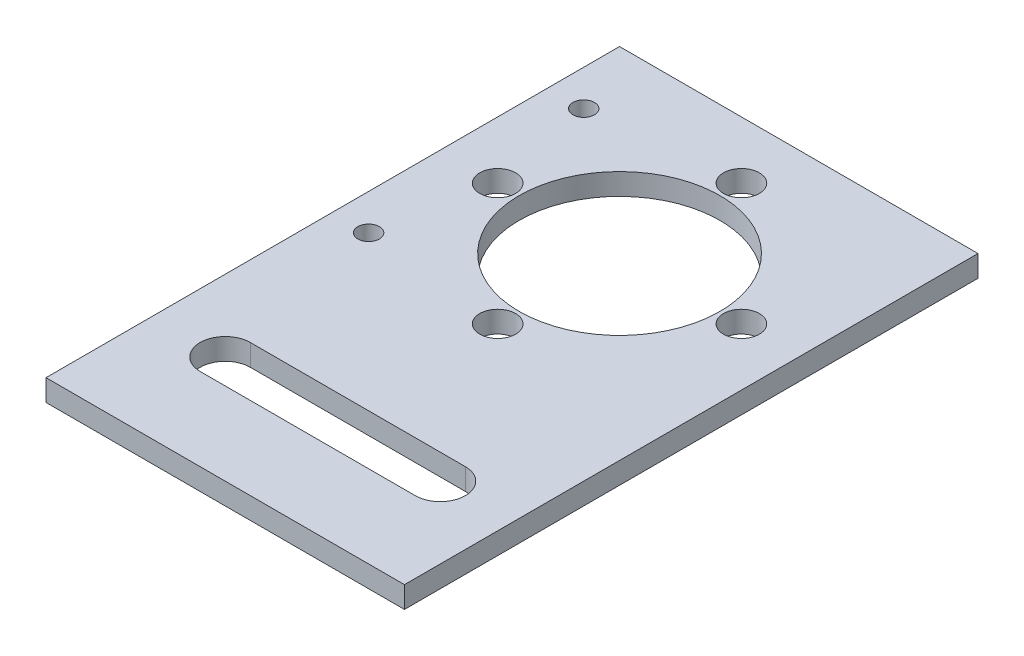
ISO-10303-21;
HEADER;
FILE_DESCRIPTION(('STEP AP214'),'2;1');
FILE_NAME('part.step','',(''),(''),'','','');
FILE_SCHEMA(('AUTOMOTIVE_DESIGN { 1 0 10303 214 1 1 1 1 }'));
ENDSEC;
DATA;
#1=APPLICATION_CONTEXT('core data for automotive mechanical design processes');
#2=APPLICATION_PROTOCOL_DEFINITION('international standard','automotive_design',2000,#1);
#3=PRODUCT_CONTEXT('',#1,'mechanical');
#4=PRODUCT('Part','Part','',(#3));
#5=PRODUCT_RELATED_PRODUCT_CATEGORY('part','',(#4));
#6=PRODUCT_DEFINITION_FORMATION('','',#4);
#7=PRODUCT_DEFINITION_CONTEXT('part definition',#1,'design');
#8=PRODUCT_DEFINITION('design','',#6,#7);
#9=PRODUCT_DEFINITION_SHAPE('','',#8);
#10=(LENGTH_UNIT() NAMED_UNIT(*) SI_UNIT(.MILLI.,.METRE.));
#11=(NAMED_UNIT(*) PLANE_ANGLE_UNIT() SI_UNIT($,.RADIAN.));
#12=(NAMED_UNIT(*) SI_UNIT($,.STERADIAN.) SOLID_ANGLE_UNIT());
#13=UNCERTAINTY_MEASURE_WITH_UNIT(LENGTH_MEASURE(1.E-05),#10,'distance_accuracy_value','');
#14=(GEOMETRIC_REPRESENTATION_CONTEXT(3) GLOBAL_UNCERTAINTY_ASSIGNED_CONTEXT((#13)) GLOBAL_UNIT_ASSIGNED_CONTEXT((#10,
#11,#12)) REPRESENTATION_CONTEXT('',''));
#15=CARTESIAN_POINT('',(0.,0.,0.));
#16=DIRECTION('',(0.,0.,1.));
#17=DIRECTION('',(1.,0.,0.));
#18=AXIS2_PLACEMENT_3D('',#15,#16,#17);
#19=CARTESIAN_POINT('',(0.,3.,0.));
#20=DIRECTION('',(0.,1.,0.));
#21=DIRECTION('',(0.,0.,1.));
#22=AXIS2_PLACEMENT_3D('',#19,#20,#21);
#23=PLANE('',#22);
#24=CARTESIAN_POINT('',(-20.,3.,0.));
#25=DIRECTION('',(0.,1.,0.));
#26=DIRECTION('',(0.,0.,1.));
#27=AXIS2_PLACEMENT_3D('',#24,#25,#26);
#28=CIRCLE('',#27,1.5);
#29=CARTESIAN_POINT('',(-20.,3.,1.5));
#30=VERTEX_POINT('',#29);
#31=EDGE_CURVE('E174',#30,#30,#28,.T.);
#32=ORIENTED_EDGE('',*,*,#31,.F.);
#33=EDGE_LOOP('',(#32));
#34=FACE_BOUND('',#33,.T.);
#35=CARTESIAN_POINT('',(-20.,3.,-30.));
#36=DIRECTION('',(0.,1.,0.));
#37=DIRECTION('',(0.,0.,1.));
#38=AXIS2_PLACEMENT_3D('',#35,#36,#37);
#39=CIRCLE('',#38,1.5);
#40=CARTESIAN_POINT('',(-20.,3.,-28.5));
#41=VERTEX_POINT('',#40);
#42=EDGE_CURVE('E180',#41,#41,#39,.T.);
#43=ORIENTED_EDGE('',*,*,#42,.F.);
#44=EDGE_LOOP('',(#43));
#45=FACE_BOUND('',#44,.T.);
#46=CARTESIAN_POINT('',(-17.,3.,-15.));
#47=DIRECTION('',(0.,1.,0.));
#48=DIRECTION('',(0.,0.,1.));
#49=AXIS2_PLACEMENT_3D('',#46,#47,#48);
#50=CIRCLE('',#49,2.49999999999988);
#51=CARTESIAN_POINT('',(-17.,3.,-12.5000000000001));
#52=VERTEX_POINT('',#51);
#53=EDGE_CURVE('E193',#52,#52,#50,.T.);
#54=ORIENTED_EDGE('',*,*,#53,.F.);
#55=EDGE_LOOP('',(#54));
#56=FACE_BOUND('',#55,.T.);
#57=CARTESIAN_POINT('',(17.,3.,-15.));
#58=DIRECTION('',(0.,1.,0.));
#59=DIRECTION('',(0.,0.,1.));
#60=AXIS2_PLACEMENT_3D('',#57,#58,#59);
#61=CIRCLE('',#60,2.4999999999999);
#62=CARTESIAN_POINT('',(17.,3.,-12.5000000000001));
#63=VERTEX_POINT('',#62);
#64=EDGE_CURVE('E132',#63,#63,#61,.T.);
#65=ORIENTED_EDGE('',*,*,#64,.F.);
#66=EDGE_LOOP('',(#65));
#67=FACE_BOUND('',#66,.T.);
#68=DIRECTION('',(0.,0.,-1.));
#69=VECTOR('',#68,1.);
#70=CARTESIAN_POINT('',(25.,3.,-40.));
#71=LINE('',#70,#69);
#72=CARTESIAN_POINT('',(25.,3.,40.));
#73=VERTEX_POINT('',#72);
#74=CARTESIAN_POINT('',(25.,3.,-40.));
#75=VERTEX_POINT('',#74);
#76=EDGE_CURVE('E148',#73,#75,#71,.T.);
#77=ORIENTED_EDGE('',*,*,#76,.T.);
#78=DIRECTION('',(-1.,0.,0.));
#79=VECTOR('',#78,1.);
#80=CARTESIAN_POINT('',(-25.,3.,-40.));
#81=LINE('',#80,#79);
#82=CARTESIAN_POINT('',(-25.,3.,-40.));
#83=VERTEX_POINT('',#82);
#84=EDGE_CURVE('E151',#75,#83,#81,.T.);
#85=ORIENTED_EDGE('',*,*,#84,.T.);
#86=DIRECTION('',(0.,0.,1.));
#87=VECTOR('',#86,1.);
#88=CARTESIAN_POINT('',(-25.,3.,-40.));
#89=LINE('',#88,#87);
#90=CARTESIAN_POINT('',(-25.,3.,40.));
#91=VERTEX_POINT('',#90);
#92=EDGE_CURVE('E154',#83,#91,#89,.T.);
#93=ORIENTED_EDGE('',*,*,#92,.T.);
#94=DIRECTION('',(1.,0.,0.));
#95=VECTOR('',#94,1.);
#96=CARTESIAN_POINT('',(-25.,3.,40.));
#97=LINE('',#96,#95);
#98=EDGE_CURVE('E156',#91,#73,#97,.T.);
#99=ORIENTED_EDGE('',*,*,#98,.T.);
#100=EDGE_LOOP('',(#77,#85,#93,#99));
#101=FACE_BOUND('',#100,.T.);
#102=CARTESIAN_POINT('',(0.,3.,-32.));
#103=DIRECTION('',(0.,1.,0.));
#104=DIRECTION('',(0.,0.,1.));
#105=AXIS2_PLACEMENT_3D('',#102,#103,#104);
#106=CIRCLE('',#105,2.5);
#107=CARTESIAN_POINT('',(0.,3.,-29.5));
#108=VERTEX_POINT('',#107);
#109=EDGE_CURVE('E142',#108,#108,#106,.T.);
#110=ORIENTED_EDGE('',*,*,#109,.F.);
#111=EDGE_LOOP('',(#110));
#112=FACE_BOUND('',#111,.T.);
#113=DIRECTION('',(1.,0.,0.));
#114=VECTOR('',#113,1.);
#115=CARTESIAN_POINT('',(-15.,3.,28.5));
#116=LINE('',#115,#114);
#117=CARTESIAN_POINT('',(-15.,3.,28.5));
#118=VERTEX_POINT('',#117);
#119=CARTESIAN_POINT('',(15.,3.,28.5));
#120=VERTEX_POINT('',#119);
#121=EDGE_CURVE('E111',#118,#120,#116,.T.);
#122=ORIENTED_EDGE('',*,*,#121,.F.);
#123=CARTESIAN_POINT('',(-15.,3.,25.));
#124=DIRECTION('',(0.,1.,0.));
#125=DIRECTION('',(0.,0.,1.));
#126=AXIS2_PLACEMENT_3D('',#123,#124,#125);
#127=CIRCLE('',#126,3.5);
#128=CARTESIAN_POINT('',(-15.,3.,21.5));
#129=VERTEX_POINT('',#128);
#130=EDGE_CURVE('E103',#129,#118,#127,.T.);
#131=ORIENTED_EDGE('',*,*,#130,.F.);
#132=DIRECTION('',(-1.,0.,0.));
#133=VECTOR('',#132,1.);
#134=CARTESIAN_POINT('',(-15.,3.,21.5));
#135=LINE('',#134,#133);
#136=CARTESIAN_POINT('',(15.,3.,21.5));
#137=VERTEX_POINT('',#136);
#138=EDGE_CURVE('E126',#137,#129,#135,.T.);
#139=ORIENTED_EDGE('',*,*,#138,.F.);
#140=CARTESIAN_POINT('',(15.,3.,25.));
#141=DIRECTION('',(0.,1.,0.));
#142=DIRECTION('',(0.,0.,1.));
#143=AXIS2_PLACEMENT_3D('',#140,#141,#142);
#144=CIRCLE('',#143,3.5);
#145=EDGE_CURVE('E124',#120,#137,#144,.T.);
#146=ORIENTED_EDGE('',*,*,#145,.F.);
#147=EDGE_LOOP('',(#122,#131,#139,#146));
#148=FACE_BOUND('',#147,.T.);
#149=CARTESIAN_POINT('',(0.,3.,2.));
#150=DIRECTION('',(0.,1.,0.));
#151=DIRECTION('',(0.,0.,1.));
#152=AXIS2_PLACEMENT_3D('',#149,#150,#151);
#153=CIRCLE('',#152,2.5);
#154=CARTESIAN_POINT('',(0.,3.,4.5));
#155=VERTEX_POINT('',#154);
#156=EDGE_CURVE('E199',#155,#155,#153,.T.);
#157=ORIENTED_EDGE('',*,*,#156,.F.);
#158=EDGE_LOOP('',(#157));
#159=FACE_BOUND('',#158,.T.);
#160=CARTESIAN_POINT('',(0.,3.,-15.));
#161=DIRECTION('',(0.,1.,0.));
#162=DIRECTION('',(0.,0.,1.));
#163=AXIS2_PLACEMENT_3D('',#160,#161,#162);
#164=CIRCLE('',#163,14.);
#165=CARTESIAN_POINT('',(0.,3.,-0.999999999999999));
#166=VERTEX_POINT('',#165);
#167=EDGE_CURVE('E187',#166,#166,#164,.T.);
#168=ORIENTED_EDGE('',*,*,#167,.F.);
#169=EDGE_LOOP('',(#168));
#170=FACE_BOUND('',#169,.T.);
#171=ADVANCED_FACE('F36',(#34,#45,#56,#67,#101,#112,#148,#159,#170),#23,.T.);
#172=CARTESIAN_POINT('',(0.,0.,0.));
#173=DIRECTION('',(0.,1.,0.));
#174=DIRECTION('',(0.,0.,1.));
#175=AXIS2_PLACEMENT_3D('',#172,#173,#174);
#176=PLANE('',#175);
#177=CARTESIAN_POINT('',(-20.,0.,0.));
#178=DIRECTION('',(0.,1.,0.));
#179=DIRECTION('',(0.,0.,1.));
#180=AXIS2_PLACEMENT_3D('',#177,#178,#179);
#181=CIRCLE('',#180,1.5);
#182=CARTESIAN_POINT('',(-20.,0.,1.5));
#183=VERTEX_POINT('',#182);
#184=EDGE_CURVE('E40',#183,#183,#181,.T.);
#185=ORIENTED_EDGE('',*,*,#184,.T.);
#186=EDGE_LOOP('',(#185));
#187=FACE_BOUND('',#186,.T.);
#188=CARTESIAN_POINT('',(-20.,0.,-30.));
#189=DIRECTION('',(0.,1.,0.));
#190=DIRECTION('',(0.,0.,1.));
#191=AXIS2_PLACEMENT_3D('',#188,#189,#190);
#192=CIRCLE('',#191,1.5);
#193=CARTESIAN_POINT('',(-20.,0.,-28.5));
#194=VERTEX_POINT('',#193);
#195=EDGE_CURVE('E172',#194,#194,#192,.T.);
#196=ORIENTED_EDGE('',*,*,#195,.T.);
#197=EDGE_LOOP('',(#196));
#198=FACE_BOUND('',#197,.T.);
#199=CARTESIAN_POINT('',(0.,0.,-32.));
#200=DIRECTION('',(0.,1.,0.));
#201=DIRECTION('',(0.,0.,1.));
#202=AXIS2_PLACEMENT_3D('',#199,#200,#201);
#203=CIRCLE('',#202,2.5);
#204=CARTESIAN_POINT('',(0.,0.,-29.5));
#205=VERTEX_POINT('',#204);
#206=EDGE_CURVE('E119',#205,#205,#203,.T.);
#207=ORIENTED_EDGE('',*,*,#206,.T.);
#208=EDGE_LOOP('',(#207));
#209=FACE_BOUND('',#208,.T.);
#210=DIRECTION('',(0.,0.,-1.));
#211=VECTOR('',#210,1.);
#212=CARTESIAN_POINT('',(25.,0.,-40.));
#213=LINE('',#212,#211);
#214=CARTESIAN_POINT('',(25.,0.,40.));
#215=VERTEX_POINT('',#214);
#216=CARTESIAN_POINT('',(25.,0.,-40.));
#217=VERTEX_POINT('',#216);
#218=EDGE_CURVE('E145',#215,#217,#213,.T.);
#219=ORIENTED_EDGE('',*,*,#218,.F.);
#220=DIRECTION('',(1.,0.,0.));
#221=VECTOR('',#220,1.);
#222=CARTESIAN_POINT('',(-25.,0.,40.));
#223=LINE('',#222,#221);
#224=CARTESIAN_POINT('',(-25.,0.,40.));
#225=VERTEX_POINT('',#224);
#226=EDGE_CURVE('E152',#225,#215,#223,.T.);
#227=ORIENTED_EDGE('',*,*,#226,.F.);
#228=DIRECTION('',(0.,0.,1.));
#229=VECTOR('',#228,1.);
#230=CARTESIAN_POINT('',(-25.,0.,-40.));
#231=LINE('',#230,#229);
#232=CARTESIAN_POINT('',(-25.,0.,-40.));
#233=VERTEX_POINT('',#232);
#234=EDGE_CURVE('E163',#233,#225,#231,.T.);
#235=ORIENTED_EDGE('',*,*,#234,.F.);
#236=DIRECTION('',(-1.,0.,0.));
#237=VECTOR('',#236,1.);
#238=CARTESIAN_POINT('',(-25.,0.,-40.));
#239=LINE('',#238,#237);
#240=EDGE_CURVE('E161',#217,#233,#239,.T.);
#241=ORIENTED_EDGE('',*,*,#240,.F.);
#242=EDGE_LOOP('',(#219,#227,#235,#241));
#243=FACE_BOUND('',#242,.T.);
#244=CARTESIAN_POINT('',(-15.,0.,25.));
#245=DIRECTION('',(0.,1.,0.));
#246=DIRECTION('',(0.,0.,1.));
#247=AXIS2_PLACEMENT_3D('',#244,#245,#246);
#248=CIRCLE('',#247,3.5);
#249=CARTESIAN_POINT('',(-15.,0.,21.5));
#250=VERTEX_POINT('',#249);
#251=CARTESIAN_POINT('',(-15.,0.,28.5));
#252=VERTEX_POINT('',#251);
#253=EDGE_CURVE('E61',#250,#252,#248,.T.);
#254=ORIENTED_EDGE('',*,*,#253,.T.);
#255=DIRECTION('',(1.,0.,0.));
#256=VECTOR('',#255,1.);
#257=CARTESIAN_POINT('',(-15.,0.,28.5));
#258=LINE('',#257,#256);
#259=CARTESIAN_POINT('',(15.,0.,28.5));
#260=VERTEX_POINT('',#259);
#261=EDGE_CURVE('E118',#252,#260,#258,.T.);
#262=ORIENTED_EDGE('',*,*,#261,.T.);
#263=CARTESIAN_POINT('',(15.,0.,25.));
#264=DIRECTION('',(0.,1.,0.));
#265=DIRECTION('',(0.,0.,1.));
#266=AXIS2_PLACEMENT_3D('',#263,#264,#265);
#267=CIRCLE('',#266,3.5);
#268=CARTESIAN_POINT('',(15.,0.,21.5));
#269=VERTEX_POINT('',#268);
#270=EDGE_CURVE('E134',#260,#269,#267,.T.);
#271=ORIENTED_EDGE('',*,*,#270,.T.);
#272=DIRECTION('',(-1.,0.,0.));
#273=VECTOR('',#272,1.);
#274=CARTESIAN_POINT('',(-15.,0.,21.5));
#275=LINE('',#274,#273);
#276=EDGE_CURVE('E112',#269,#250,#275,.T.);
#277=ORIENTED_EDGE('',*,*,#276,.T.);
#278=EDGE_LOOP('',(#254,#262,#271,#277));
#279=FACE_BOUND('',#278,.T.);
#280=CARTESIAN_POINT('',(17.,0.,-15.));
#281=DIRECTION('',(0.,1.,0.));
#282=DIRECTION('',(0.,0.,1.));
#283=AXIS2_PLACEMENT_3D('',#280,#281,#282);
#284=CIRCLE('',#283,2.4999999999999);
#285=CARTESIAN_POINT('',(17.,0.,-12.5000000000001));
#286=VERTEX_POINT('',#285);
#287=EDGE_CURVE('E202',#286,#286,#284,.T.);
#288=ORIENTED_EDGE('',*,*,#287,.T.);
#289=EDGE_LOOP('',(#288));
#290=FACE_BOUND('',#289,.T.);
#291=CARTESIAN_POINT('',(0.,0.,2.));
#292=DIRECTION('',(0.,1.,0.));
#293=DIRECTION('',(0.,0.,1.));
#294=AXIS2_PLACEMENT_3D('',#291,#292,#293);
#295=CIRCLE('',#294,2.5);
#296=CARTESIAN_POINT('',(0.,0.,4.5));
#297=VERTEX_POINT('',#296);
#298=EDGE_CURVE('E196',#297,#297,#295,.T.);
#299=ORIENTED_EDGE('',*,*,#298,.T.);
#300=EDGE_LOOP('',(#299));
#301=FACE_BOUND('',#300,.T.);
#302=CARTESIAN_POINT('',(-17.,0.,-15.));
#303=DIRECTION('',(0.,1.,0.));
#304=DIRECTION('',(0.,0.,1.));
#305=AXIS2_PLACEMENT_3D('',#302,#303,#304);
#306=CIRCLE('',#305,2.49999999999988);
#307=CARTESIAN_POINT('',(-17.,0.,-12.5000000000001));
#308=VERTEX_POINT('',#307);
#309=EDGE_CURVE('E190',#308,#308,#306,.T.);
#310=ORIENTED_EDGE('',*,*,#309,.T.);
#311=EDGE_LOOP('',(#310));
#312=FACE_BOUND('',#311,.T.);
#313=CARTESIAN_POINT('',(0.,0.,-15.));
#314=DIRECTION('',(0.,1.,0.));
#315=DIRECTION('',(0.,0.,1.));
#316=AXIS2_PLACEMENT_3D('',#313,#314,#315);
#317=CIRCLE('',#316,14.);
#318=CARTESIAN_POINT('',(0.,0.,-0.999999999999999));
#319=VERTEX_POINT('',#318);
#320=EDGE_CURVE('E178',#319,#319,#317,.T.);
#321=ORIENTED_EDGE('',*,*,#320,.T.);
#322=EDGE_LOOP('',(#321));
#323=FACE_BOUND('',#322,.T.);
#324=ADVANCED_FACE('F209',(#187,#198,#209,#243,#279,#290,#301,#312,#323),#176,.F.);
#325=CARTESIAN_POINT('',(25.,3.,-40.));
#326=DIRECTION('',(-1.,0.,0.));
#327=DIRECTION('',(0.,0.,1.));
#328=AXIS2_PLACEMENT_3D('',#325,#326,#327);
#329=PLANE('',#328);
#330=ORIENTED_EDGE('',*,*,#218,.T.);
#331=DIRECTION('',(0.,-1.,0.));
#332=VECTOR('',#331,1.);
#333=CARTESIAN_POINT('',(25.,3.,-40.));
#334=LINE('',#333,#332);
#335=EDGE_CURVE('E11',#75,#217,#334,.T.);
#336=ORIENTED_EDGE('',*,*,#335,.F.);
#337=ORIENTED_EDGE('',*,*,#76,.F.);
#338=DIRECTION('',(0.,-1.,0.));
#339=VECTOR('',#338,1.);
#340=CARTESIAN_POINT('',(25.,3.,40.));
#341=LINE('',#340,#339);
#342=EDGE_CURVE('E158',#73,#215,#341,.T.);
#343=ORIENTED_EDGE('',*,*,#342,.T.);
#344=EDGE_LOOP('',(#330,#336,#337,#343));
#345=FACE_BOUND('',#344,.T.);
#346=ADVANCED_FACE('F38',(#345),#329,.F.);
#347=CARTESIAN_POINT('',(-25.,3.,-40.));
#348=DIRECTION('',(0.,0.,1.));
#349=DIRECTION('',(1.,0.,0.));
#350=AXIS2_PLACEMENT_3D('',#347,#348,#349);
#351=PLANE('',#350);
#352=ORIENTED_EDGE('',*,*,#240,.T.);
#353=DIRECTION('',(0.,-1.,0.));
#354=VECTOR('',#353,1.);
#355=CARTESIAN_POINT('',(-25.,3.,-40.));
#356=LINE('',#355,#354);
#357=EDGE_CURVE('E45',#83,#233,#356,.T.);
#358=ORIENTED_EDGE('',*,*,#357,.F.);
#359=ORIENTED_EDGE('',*,*,#84,.F.);
#360=ORIENTED_EDGE('',*,*,#335,.T.);
#361=EDGE_LOOP('',(#352,#358,#359,#360));
#362=FACE_BOUND('',#361,.T.);
#363=ADVANCED_FACE('F246',(#362),#351,.F.);
#364=CARTESIAN_POINT('',(-25.,3.,-40.));
#365=DIRECTION('',(1.,0.,0.));
#366=DIRECTION('',(0.,0.,-1.));
#367=AXIS2_PLACEMENT_3D('',#364,#365,#366);
#368=PLANE('',#367);
#369=ORIENTED_EDGE('',*,*,#234,.T.);
#370=DIRECTION('',(0.,-1.,0.));
#371=VECTOR('',#370,1.);
#372=CARTESIAN_POINT('',(-25.,3.,40.));
#373=LINE('',#372,#371);
#374=EDGE_CURVE('E168',#91,#225,#373,.T.);
#375=ORIENTED_EDGE('',*,*,#374,.F.);
#376=ORIENTED_EDGE('',*,*,#92,.F.);
#377=ORIENTED_EDGE('',*,*,#357,.T.);
#378=EDGE_LOOP('',(#369,#375,#376,#377));
#379=FACE_BOUND('',#378,.T.);
#380=ADVANCED_FACE('F243',(#379),#368,.F.);
#381=CARTESIAN_POINT('',(-25.,3.,40.));
#382=DIRECTION('',(0.,0.,-1.));
#383=DIRECTION('',(-1.,0.,0.));
#384=AXIS2_PLACEMENT_3D('',#381,#382,#383);
#385=PLANE('',#384);
#386=ORIENTED_EDGE('',*,*,#226,.T.);
#387=ORIENTED_EDGE('',*,*,#342,.F.);
#388=ORIENTED_EDGE('',*,*,#98,.F.);
#389=ORIENTED_EDGE('',*,*,#374,.T.);
#390=EDGE_LOOP('',(#386,#387,#388,#389));
#391=FACE_BOUND('',#390,.T.);
#392=ADVANCED_FACE('F240',(#391),#385,.F.);
#393=CARTESIAN_POINT('',(0.,3.,-32.));
#394=DIRECTION('',(0.,-1.,0.));
#395=DIRECTION('',(0.,0.,-1.));
#396=AXIS2_PLACEMENT_3D('',#393,#394,#395);
#397=CYLINDRICAL_SURFACE('',#396,2.5);
#398=ORIENTED_EDGE('',*,*,#109,.T.);
#399=EDGE_LOOP('',(#398));
#400=FACE_BOUND('',#399,.T.);
#401=ORIENTED_EDGE('',*,*,#206,.F.);
#402=EDGE_LOOP('',(#401));
#403=FACE_BOUND('',#402,.T.);
#404=ADVANCED_FACE('F237',(#400,#403),#397,.F.);
#405=CARTESIAN_POINT('',(-15.,3.,25.));
#406=DIRECTION('',(0.,-1.,0.));
#407=DIRECTION('',(0.,0.,-1.));
#408=AXIS2_PLACEMENT_3D('',#405,#406,#407);
#409=CYLINDRICAL_SURFACE('',#408,3.5);
#410=ORIENTED_EDGE('',*,*,#253,.F.);
#411=DIRECTION('',(0.,-1.,0.));
#412=VECTOR('',#411,1.);
#413=CARTESIAN_POINT('',(-15.,3.,21.5));
#414=LINE('',#413,#412);
#415=EDGE_CURVE('E107',#129,#250,#414,.T.);
#416=ORIENTED_EDGE('',*,*,#415,.F.);
#417=ORIENTED_EDGE('',*,*,#130,.T.);
#418=DIRECTION('',(0.,-1.,0.));
#419=VECTOR('',#418,1.);
#420=CARTESIAN_POINT('',(-15.,3.,28.5));
#421=LINE('',#420,#419);
#422=EDGE_CURVE('E106',#118,#252,#421,.T.);
#423=ORIENTED_EDGE('',*,*,#422,.T.);
#424=EDGE_LOOP('',(#410,#416,#417,#423));
#425=FACE_BOUND('',#424,.T.);
#426=ADVANCED_FACE('F105',(#425),#409,.F.);
#427=CARTESIAN_POINT('',(-15.,3.,28.5));
#428=DIRECTION('',(0.,0.,-1.));
#429=DIRECTION('',(-1.,0.,0.));
#430=AXIS2_PLACEMENT_3D('',#427,#428,#429);
#431=PLANE('',#430);
#432=ORIENTED_EDGE('',*,*,#261,.F.);
#433=ORIENTED_EDGE('',*,*,#422,.F.);
#434=ORIENTED_EDGE('',*,*,#121,.T.);
#435=DIRECTION('',(0.,-1.,0.));
#436=VECTOR('',#435,1.);
#437=CARTESIAN_POINT('',(15.,3.,28.5));
#438=LINE('',#437,#436);
#439=EDGE_CURVE('E120',#120,#260,#438,.T.);
#440=ORIENTED_EDGE('',*,*,#439,.T.);
#441=EDGE_LOOP('',(#432,#433,#434,#440));
#442=FACE_BOUND('',#441,.T.);
#443=ADVANCED_FACE('F115',(#442),#431,.T.);
#444=CARTESIAN_POINT('',(15.,3.,25.));
#445=DIRECTION('',(0.,-1.,0.));
#446=DIRECTION('',(0.,0.,-1.));
#447=AXIS2_PLACEMENT_3D('',#444,#445,#446);
#448=CYLINDRICAL_SURFACE('',#447,3.5);
#449=ORIENTED_EDGE('',*,*,#270,.F.);
#450=ORIENTED_EDGE('',*,*,#439,.F.);
#451=ORIENTED_EDGE('',*,*,#145,.T.);
#452=DIRECTION('',(0.,-1.,0.));
#453=VECTOR('',#452,1.);
#454=CARTESIAN_POINT('',(15.,3.,21.5));
#455=LINE('',#454,#453);
#456=EDGE_CURVE('E53',#137,#269,#455,.T.);
#457=ORIENTED_EDGE('',*,*,#456,.T.);
#458=EDGE_LOOP('',(#449,#450,#451,#457));
#459=FACE_BOUND('',#458,.T.);
#460=ADVANCED_FACE('F225',(#459),#448,.F.);
#461=CARTESIAN_POINT('',(-15.,3.,21.5));
#462=DIRECTION('',(0.,0.,1.));
#463=DIRECTION('',(1.,0.,0.));
#464=AXIS2_PLACEMENT_3D('',#461,#462,#463);
#465=PLANE('',#464);
#466=ORIENTED_EDGE('',*,*,#276,.F.);
#467=ORIENTED_EDGE('',*,*,#456,.F.);
#468=ORIENTED_EDGE('',*,*,#138,.T.);
#469=ORIENTED_EDGE('',*,*,#415,.T.);
#470=EDGE_LOOP('',(#466,#467,#468,#469));
#471=FACE_BOUND('',#470,.T.);
#472=ADVANCED_FACE('F215',(#471),#465,.T.);
#473=CARTESIAN_POINT('',(17.,3.,-15.));
#474=DIRECTION('',(0.,-1.,0.));
#475=DIRECTION('',(0.,0.,-1.));
#476=AXIS2_PLACEMENT_3D('',#473,#474,#475);
#477=CYLINDRICAL_SURFACE('',#476,2.4999999999999);
#478=ORIENTED_EDGE('',*,*,#64,.T.);
#479=EDGE_LOOP('',(#478));
#480=FACE_BOUND('',#479,.T.);
#481=ORIENTED_EDGE('',*,*,#287,.F.);
#482=EDGE_LOOP('',(#481));
#483=FACE_BOUND('',#482,.T.);
#484=ADVANCED_FACE('F212',(#480,#483),#477,.F.);
#485=CARTESIAN_POINT('',(0.,3.,2.));
#486=DIRECTION('',(0.,-1.,0.));
#487=DIRECTION('',(0.,0.,-1.));
#488=AXIS2_PLACEMENT_3D('',#485,#486,#487);
#489=CYLINDRICAL_SURFACE('',#488,2.5);
#490=ORIENTED_EDGE('',*,*,#156,.T.);
#491=EDGE_LOOP('',(#490));
#492=FACE_BOUND('',#491,.T.);
#493=ORIENTED_EDGE('',*,*,#298,.F.);
#494=EDGE_LOOP('',(#493));
#495=FACE_BOUND('',#494,.T.);
#496=ADVANCED_FACE('F214',(#492,#495),#489,.F.);
#497=CARTESIAN_POINT('',(-17.,3.,-15.));
#498=DIRECTION('',(0.,-1.,0.));
#499=DIRECTION('',(0.,0.,-1.));
#500=AXIS2_PLACEMENT_3D('',#497,#498,#499);
#501=CYLINDRICAL_SURFACE('',#500,2.49999999999988);
#502=ORIENTED_EDGE('',*,*,#53,.T.);
#503=EDGE_LOOP('',(#502));
#504=FACE_BOUND('',#503,.T.);
#505=ORIENTED_EDGE('',*,*,#309,.F.);
#506=EDGE_LOOP('',(#505));
#507=FACE_BOUND('',#506,.T.);
#508=ADVANCED_FACE('F222',(#504,#507),#501,.F.);
#509=CARTESIAN_POINT('',(0.,3.,-15.));
#510=DIRECTION('',(0.,-1.,0.));
#511=DIRECTION('',(0.,0.,-1.));
#512=AXIS2_PLACEMENT_3D('',#509,#510,#511);
#513=CYLINDRICAL_SURFACE('',#512,14.);
#514=ORIENTED_EDGE('',*,*,#167,.T.);
#515=EDGE_LOOP('',(#514));
#516=FACE_BOUND('',#515,.T.);
#517=ORIENTED_EDGE('',*,*,#320,.F.);
#518=EDGE_LOOP('',(#517));
#519=FACE_BOUND('',#518,.T.);
#520=ADVANCED_FACE('F312',(#516,#519),#513,.F.);
#521=CARTESIAN_POINT('',(-20.,-7.,-30.));
#522=DIRECTION('',(0.,1.,0.));
#523=DIRECTION('',(0.,0.,1.));
#524=AXIS2_PLACEMENT_3D('',#521,#522,#523);
#525=CYLINDRICAL_SURFACE('',#524,1.5);
#526=ORIENTED_EDGE('',*,*,#42,.T.);
#527=EDGE_LOOP('',(#526));
#528=FACE_BOUND('',#527,.T.);
#529=ORIENTED_EDGE('',*,*,#195,.F.);
#530=EDGE_LOOP('',(#529));
#531=FACE_BOUND('',#530,.T.);
#532=ADVANCED_FACE('F321',(#528,#531),#525,.F.);
#533=CARTESIAN_POINT('',(-20.,-7.,0.));
#534=DIRECTION('',(0.,1.,0.));
#535=DIRECTION('',(0.,0.,1.));
#536=AXIS2_PLACEMENT_3D('',#533,#534,#535);
#537=CYLINDRICAL_SURFACE('',#536,1.5);
#538=ORIENTED_EDGE('',*,*,#31,.T.);
#539=EDGE_LOOP('',(#538));
#540=FACE_BOUND('',#539,.T.);
#541=ORIENTED_EDGE('',*,*,#184,.F.);
#542=EDGE_LOOP('',(#541));
#543=FACE_BOUND('',#542,.T.);
#544=ADVANCED_FACE('F343',(#540,#543),#537,.F.);
#545=CLOSED_SHELL('',(#171,#324,#346,#363,#380,#392,#404,#426,#443,#460,#472,#484,#496,#508,
#520,#532,#544));
#546=MANIFOLD_SOLID_BREP('B2',#545);
#547=ADVANCED_BREP_SHAPE_REPRESENTATION('',(#18,#546),#14);
#548=SHAPE_DEFINITION_REPRESENTATION(#9,#547);
ENDSEC;
END-ISO-10303-21;
